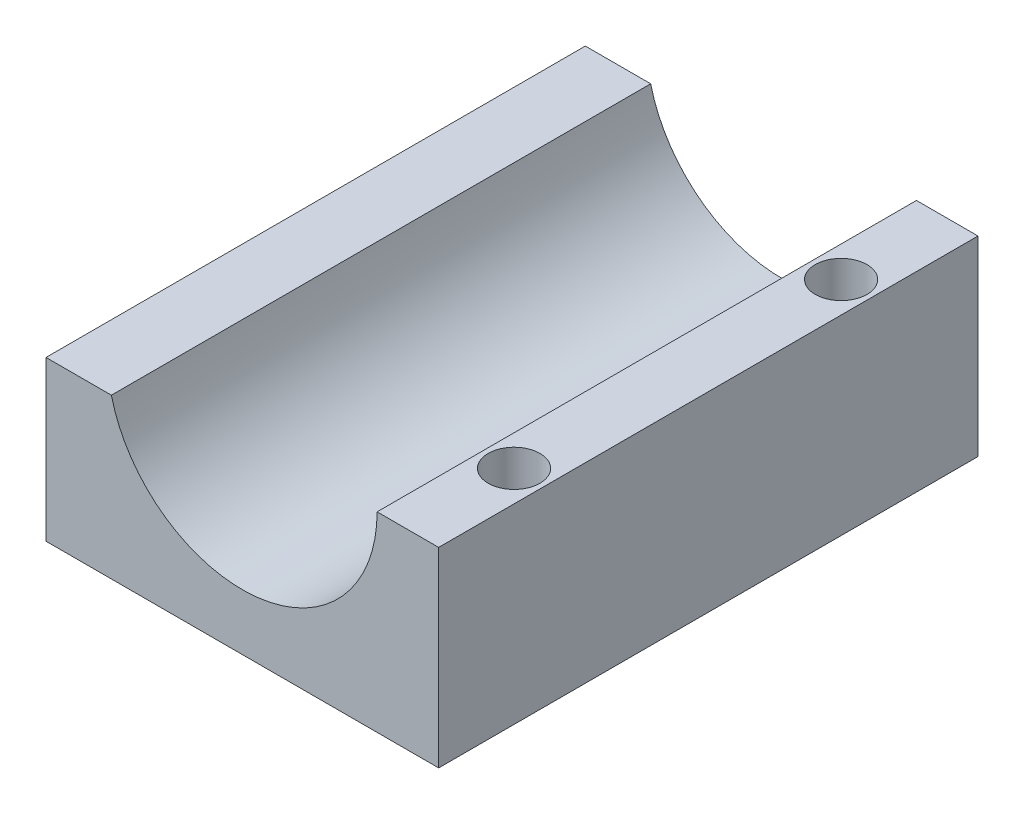
ISO-10303-21;
HEADER;
FILE_DESCRIPTION(('STEP AP214'),'2;1');
FILE_NAME('part.step','',(''),(''),'','','');
FILE_SCHEMA(('AUTOMOTIVE_DESIGN { 1 0 10303 214 1 1 1 1 }'));
ENDSEC;
DATA;
#1=APPLICATION_CONTEXT('core data for automotive mechanical design processes');
#2=APPLICATION_PROTOCOL_DEFINITION('international standard','automotive_design',2000,#1);
#3=PRODUCT_CONTEXT('',#1,'mechanical');
#4=PRODUCT('Part','Part','',(#3));
#5=PRODUCT_RELATED_PRODUCT_CATEGORY('part','',(#4));
#6=PRODUCT_DEFINITION_FORMATION('','',#4);
#7=PRODUCT_DEFINITION_CONTEXT('part definition',#1,'design');
#8=PRODUCT_DEFINITION('design','',#6,#7);
#9=PRODUCT_DEFINITION_SHAPE('','',#8);
#10=(LENGTH_UNIT() NAMED_UNIT(*) SI_UNIT(.MILLI.,.METRE.));
#11=(NAMED_UNIT(*) PLANE_ANGLE_UNIT() SI_UNIT($,.RADIAN.));
#12=(NAMED_UNIT(*) SI_UNIT($,.STERADIAN.) SOLID_ANGLE_UNIT());
#13=UNCERTAINTY_MEASURE_WITH_UNIT(LENGTH_MEASURE(1.E-05),#10,'distance_accuracy_value','');
#14=(GEOMETRIC_REPRESENTATION_CONTEXT(3) GLOBAL_UNCERTAINTY_ASSIGNED_CONTEXT((#13)) GLOBAL_UNIT_ASSIGNED_CONTEXT((#10,
#11,#12)) REPRESENTATION_CONTEXT('',''));
#15=CARTESIAN_POINT('',(0.,0.,0.));
#16=DIRECTION('',(0.,0.,1.));
#17=DIRECTION('',(1.,0.,0.));
#18=AXIS2_PLACEMENT_3D('',#15,#16,#17);
#19=CARTESIAN_POINT('',(0.,9.,0.));
#20=DIRECTION('',(1.,0.,0.));
#21=DIRECTION('',(0.,0.,-1.));
#22=AXIS2_PLACEMENT_3D('',#19,#20,#21);
#23=PLANE('',#22);
#24=DIRECTION('',(0.,0.,1.));
#25=VECTOR('',#24,1.);
#26=CARTESIAN_POINT('',(0.,7.5,-66.2778912014065));
#27=LINE('',#26,#25);
#28=CARTESIAN_POINT('',(0.,7.5,-25.41));
#29=VERTEX_POINT('',#28);
#30=CARTESIAN_POINT('',(0.,7.5,0.));
#31=VERTEX_POINT('',#30);
#32=EDGE_CURVE('E88',#29,#31,#27,.T.);
#33=ORIENTED_EDGE('',*,*,#32,.F.);
#34=DIRECTION('',(0.,-1.,0.));
#35=VECTOR('',#34,1.);
#36=CARTESIAN_POINT('',(0.,9.,-25.41));
#37=LINE('',#36,#35);
#38=CARTESIAN_POINT('',(0.,0.,-25.41));
#39=VERTEX_POINT('',#38);
#40=EDGE_CURVE('E82',#29,#39,#37,.T.);
#41=ORIENTED_EDGE('',*,*,#40,.T.);
#42=DIRECTION('',(0.,0.,1.));
#43=VECTOR('',#42,1.);
#44=CARTESIAN_POINT('',(0.,0.,0.));
#45=LINE('',#44,#43);
#46=CARTESIAN_POINT('',(0.,0.,0.));
#47=VERTEX_POINT('',#46);
#48=EDGE_CURVE('E86',#39,#47,#45,.T.);
#49=ORIENTED_EDGE('',*,*,#48,.T.);
#50=DIRECTION('',(0.,-1.,0.));
#51=VECTOR('',#50,1.);
#52=CARTESIAN_POINT('',(0.,9.,0.));
#53=LINE('',#52,#51);
#54=EDGE_CURVE('E47',#31,#47,#53,.T.);
#55=ORIENTED_EDGE('',*,*,#54,.F.);
#56=EDGE_LOOP('',(#33,#41,#49,#55));
#57=FACE_BOUND('',#56,.T.);
#58=ADVANCED_FACE('F39',(#57),#23,.F.);
#59=CARTESIAN_POINT('',(0.,9.,-25.41));
#60=DIRECTION('',(0.,0.,1.));
#61=DIRECTION('',(1.,0.,0.));
#62=AXIS2_PLACEMENT_3D('',#59,#60,#61);
#63=PLANE('',#62);
#64=DIRECTION('',(-1.,0.,0.));
#65=VECTOR('',#64,1.);
#66=CARTESIAN_POINT('',(0.,7.5,-25.41));
#67=LINE('',#66,#65);
#68=CARTESIAN_POINT('',(3.07970827269893,7.5,-25.41));
#69=VERTEX_POINT('',#68);
#70=EDGE_CURVE('E160',#69,#29,#67,.T.);
#71=ORIENTED_EDGE('',*,*,#70,.F.);
#72=CARTESIAN_POINT('',(9.25,9.,-25.41));
#73=DIRECTION('',(0.,0.,1.));
#74=DIRECTION('',(1.,0.,0.));
#75=AXIS2_PLACEMENT_3D('',#72,#73,#74);
#76=CIRCLE('',#75,6.35);
#77=CARTESIAN_POINT('',(15.6,9.,-25.41));
#78=VERTEX_POINT('',#77);
#79=EDGE_CURVE('E116',#69,#78,#76,.T.);
#80=ORIENTED_EDGE('',*,*,#79,.T.);
#81=DIRECTION('',(-1.,0.,0.));
#82=VECTOR('',#81,1.);
#83=CARTESIAN_POINT('',(0.,9.,-25.41));
#84=LINE('',#83,#82);
#85=CARTESIAN_POINT('',(18.5,9.,-25.41));
#86=VERTEX_POINT('',#85);
#87=EDGE_CURVE('E93',#86,#78,#84,.T.);
#88=ORIENTED_EDGE('',*,*,#87,.F.);
#89=DIRECTION('',(0.,-1.,0.));
#90=VECTOR('',#89,1.);
#91=CARTESIAN_POINT('',(18.5,9.,-25.41));
#92=LINE('',#91,#90);
#93=CARTESIAN_POINT('',(18.5,0.,-25.41));
#94=VERTEX_POINT('',#93);
#95=EDGE_CURVE('E92',#86,#94,#92,.T.);
#96=ORIENTED_EDGE('',*,*,#95,.T.);
#97=DIRECTION('',(-1.,0.,0.));
#98=VECTOR('',#97,1.);
#99=CARTESIAN_POINT('',(0.,0.,-25.41));
#100=LINE('',#99,#98);
#101=EDGE_CURVE('E97',#94,#39,#100,.T.);
#102=ORIENTED_EDGE('',*,*,#101,.T.);
#103=ORIENTED_EDGE('',*,*,#40,.F.);
#104=EDGE_LOOP('',(#71,#80,#88,#96,#102,#103));
#105=FACE_BOUND('',#104,.T.);
#106=ADVANCED_FACE('F98',(#105),#63,.F.);
#107=CARTESIAN_POINT('',(0.,9.,0.));
#108=DIRECTION('',(0.,-1.,0.));
#109=DIRECTION('',(0.,0.,-1.));
#110=AXIS2_PLACEMENT_3D('',#107,#108,#109);
#111=PLANE('',#110);
#112=CARTESIAN_POINT('',(17.05,9.,-20.41));
#113=DIRECTION('',(0.,1.,0.));
#114=DIRECTION('',(0.,0.,1.));
#115=AXIS2_PLACEMENT_3D('',#112,#113,#114);
#116=CIRCLE('',#115,1.22);
#117=CARTESIAN_POINT('',(17.05,9.,-19.19));
#118=VERTEX_POINT('',#117);
#119=EDGE_CURVE('E174',#118,#118,#116,.T.);
#120=ORIENTED_EDGE('',*,*,#119,.F.);
#121=EDGE_LOOP('',(#120));
#122=FACE_BOUND('',#121,.T.);
#123=CARTESIAN_POINT('',(17.05,9.,-5.));
#124=DIRECTION('',(0.,1.,0.));
#125=DIRECTION('',(0.,0.,1.));
#126=AXIS2_PLACEMENT_3D('',#123,#124,#125);
#127=CIRCLE('',#126,1.22);
#128=CARTESIAN_POINT('',(17.05,9.,-3.78));
#129=VERTEX_POINT('',#128);
#130=EDGE_CURVE('E166',#129,#129,#127,.T.);
#131=ORIENTED_EDGE('',*,*,#130,.F.);
#132=EDGE_LOOP('',(#131));
#133=FACE_BOUND('',#132,.T.);
#134=ORIENTED_EDGE('',*,*,#87,.T.);
#135=DIRECTION('',(0.,0.,1.));
#136=VECTOR('',#135,1.);
#137=CARTESIAN_POINT('',(15.6,9.,-25.41));
#138=LINE('',#137,#136);
#139=CARTESIAN_POINT('',(15.6,9.,0.));
#140=VERTEX_POINT('',#139);
#141=EDGE_CURVE('E110',#78,#140,#138,.T.);
#142=ORIENTED_EDGE('',*,*,#141,.T.);
#143=DIRECTION('',(1.,0.,0.));
#144=VECTOR('',#143,1.);
#145=CARTESIAN_POINT('',(0.,9.,0.));
#146=LINE('',#145,#144);
#147=CARTESIAN_POINT('',(18.5,9.,0.));
#148=VERTEX_POINT('',#147);
#149=EDGE_CURVE('E103',#140,#148,#146,.T.);
#150=ORIENTED_EDGE('',*,*,#149,.T.);
#151=DIRECTION('',(0.,0.,-1.));
#152=VECTOR('',#151,1.);
#153=CARTESIAN_POINT('',(18.5,9.,0.));
#154=LINE('',#153,#152);
#155=EDGE_CURVE('E62',#148,#86,#154,.T.);
#156=ORIENTED_EDGE('',*,*,#155,.T.);
#157=EDGE_LOOP('',(#134,#142,#150,#156));
#158=FACE_BOUND('',#157,.T.);
#159=ADVANCED_FACE('F151',(#122,#133,#158),#111,.F.);
#160=CARTESIAN_POINT('',(0.,9.,0.));
#161=DIRECTION('',(0.,0.,-1.));
#162=DIRECTION('',(-1.,0.,0.));
#163=AXIS2_PLACEMENT_3D('',#160,#161,#162);
#164=PLANE('',#163);
#165=CARTESIAN_POINT('',(9.25,9.,0.));
#166=DIRECTION('',(0.,0.,1.));
#167=DIRECTION('',(1.,0.,0.));
#168=AXIS2_PLACEMENT_3D('',#165,#166,#167);
#169=CIRCLE('',#168,6.35);
#170=CARTESIAN_POINT('',(3.07970827269893,7.5,0.));
#171=VERTEX_POINT('',#170);
#172=EDGE_CURVE('E145',#171,#140,#169,.T.);
#173=ORIENTED_EDGE('',*,*,#172,.F.);
#174=DIRECTION('',(-1.,0.,0.));
#175=VECTOR('',#174,1.);
#176=CARTESIAN_POINT('',(0.,7.5,0.));
#177=LINE('',#176,#175);
#178=EDGE_CURVE('E54',#171,#31,#177,.T.);
#179=ORIENTED_EDGE('',*,*,#178,.T.);
#180=ORIENTED_EDGE('',*,*,#54,.T.);
#181=DIRECTION('',(1.,0.,0.));
#182=VECTOR('',#181,1.);
#183=CARTESIAN_POINT('',(0.,0.,0.));
#184=LINE('',#183,#182);
#185=CARTESIAN_POINT('',(18.5,0.,0.));
#186=VERTEX_POINT('',#185);
#187=EDGE_CURVE('E108',#47,#186,#184,.T.);
#188=ORIENTED_EDGE('',*,*,#187,.T.);
#189=DIRECTION('',(0.,-1.,0.));
#190=VECTOR('',#189,1.);
#191=CARTESIAN_POINT('',(18.5,9.,0.));
#192=LINE('',#191,#190);
#193=EDGE_CURVE('E125',#148,#186,#192,.T.);
#194=ORIENTED_EDGE('',*,*,#193,.F.);
#195=ORIENTED_EDGE('',*,*,#149,.F.);
#196=EDGE_LOOP('',(#173,#179,#180,#188,#194,#195));
#197=FACE_BOUND('',#196,.T.);
#198=ADVANCED_FACE('F131',(#197),#164,.F.);
#199=CARTESIAN_POINT('',(18.5,9.,0.));
#200=DIRECTION('',(-1.,0.,0.));
#201=DIRECTION('',(0.,0.,1.));
#202=AXIS2_PLACEMENT_3D('',#199,#200,#201);
#203=PLANE('',#202);
#204=DIRECTION('',(0.,0.,-1.));
#205=VECTOR('',#204,1.);
#206=CARTESIAN_POINT('',(18.5,0.,0.));
#207=LINE('',#206,#205);
#208=EDGE_CURVE('E104',#186,#94,#207,.T.);
#209=ORIENTED_EDGE('',*,*,#208,.T.);
#210=ORIENTED_EDGE('',*,*,#95,.F.);
#211=ORIENTED_EDGE('',*,*,#155,.F.);
#212=ORIENTED_EDGE('',*,*,#193,.T.);
#213=EDGE_LOOP('',(#209,#210,#211,#212));
#214=FACE_BOUND('',#213,.T.);
#215=ADVANCED_FACE('F214',(#214),#203,.F.);
#216=CARTESIAN_POINT('',(0.,0.,0.));
#217=DIRECTION('',(0.,-1.,0.));
#218=DIRECTION('',(0.,0.,-1.));
#219=AXIS2_PLACEMENT_3D('',#216,#217,#218);
#220=PLANE('',#219);
#221=CARTESIAN_POINT('',(17.05,0.,-20.41));
#222=DIRECTION('',(0.,1.,0.));
#223=DIRECTION('',(0.,0.,1.));
#224=AXIS2_PLACEMENT_3D('',#221,#222,#223);
#225=CIRCLE('',#224,1.22);
#226=CARTESIAN_POINT('',(17.05,0.,-19.19));
#227=VERTEX_POINT('',#226);
#228=EDGE_CURVE('E163',#227,#227,#225,.T.);
#229=ORIENTED_EDGE('',*,*,#228,.T.);
#230=EDGE_LOOP('',(#229));
#231=FACE_BOUND('',#230,.T.);
#232=CARTESIAN_POINT('',(17.05,0.,-5.));
#233=DIRECTION('',(0.,1.,0.));
#234=DIRECTION('',(0.,0.,1.));
#235=AXIS2_PLACEMENT_3D('',#232,#233,#234);
#236=CIRCLE('',#235,1.22);
#237=CARTESIAN_POINT('',(17.05,0.,-3.78));
#238=VERTEX_POINT('',#237);
#239=EDGE_CURVE('E170',#238,#238,#236,.T.);
#240=ORIENTED_EDGE('',*,*,#239,.T.);
#241=EDGE_LOOP('',(#240));
#242=FACE_BOUND('',#241,.T.);
#243=ORIENTED_EDGE('',*,*,#48,.F.);
#244=ORIENTED_EDGE('',*,*,#101,.F.);
#245=ORIENTED_EDGE('',*,*,#208,.F.);
#246=ORIENTED_EDGE('',*,*,#187,.F.);
#247=EDGE_LOOP('',(#243,#244,#245,#246));
#248=FACE_BOUND('',#247,.T.);
#249=ADVANCED_FACE('F107',(#231,#242,#248),#220,.T.);
#250=CARTESIAN_POINT('',(9.25,9.,-25.41));
#251=DIRECTION('',(0.,0.,1.));
#252=DIRECTION('',(1.,0.,0.));
#253=AXIS2_PLACEMENT_3D('',#250,#251,#252);
#254=CYLINDRICAL_SURFACE('',#253,6.35);
#255=ORIENTED_EDGE('',*,*,#79,.F.);
#256=DIRECTION('',(0.,0.,1.));
#257=VECTOR('',#256,1.);
#258=CARTESIAN_POINT('',(3.07970827269893,7.5,-25.41));
#259=LINE('',#258,#257);
#260=EDGE_CURVE('E11',#69,#171,#259,.T.);
#261=ORIENTED_EDGE('',*,*,#260,.T.);
#262=ORIENTED_EDGE('',*,*,#172,.T.);
#263=ORIENTED_EDGE('',*,*,#141,.F.);
#264=EDGE_LOOP('',(#255,#261,#262,#263));
#265=FACE_BOUND('',#264,.T.);
#266=ADVANCED_FACE('F147',(#265),#254,.F.);
#267=CARTESIAN_POINT('',(0.,7.5,-66.2778912014065));
#268=DIRECTION('',(0.,-1.,0.));
#269=DIRECTION('',(0.,0.,-1.));
#270=AXIS2_PLACEMENT_3D('',#267,#268,#269);
#271=PLANE('',#270);
#272=ORIENTED_EDGE('',*,*,#260,.F.);
#273=ORIENTED_EDGE('',*,*,#70,.T.);
#274=ORIENTED_EDGE('',*,*,#32,.T.);
#275=ORIENTED_EDGE('',*,*,#178,.F.);
#276=EDGE_LOOP('',(#272,#273,#274,#275));
#277=FACE_BOUND('',#276,.T.);
#278=ADVANCED_FACE('F197',(#277),#271,.F.);
#279=CARTESIAN_POINT('',(17.05,0.,-5.));
#280=DIRECTION('',(0.,1.,0.));
#281=DIRECTION('',(0.,0.,1.));
#282=AXIS2_PLACEMENT_3D('',#279,#280,#281);
#283=CYLINDRICAL_SURFACE('',#282,1.22);
#284=ORIENTED_EDGE('',*,*,#239,.F.);
#285=EDGE_LOOP('',(#284));
#286=FACE_BOUND('',#285,.T.);
#287=ORIENTED_EDGE('',*,*,#130,.T.);
#288=EDGE_LOOP('',(#287));
#289=FACE_BOUND('',#288,.T.);
#290=ADVANCED_FACE('F187',(#286,#289),#283,.F.);
#291=CARTESIAN_POINT('',(17.05,0.,-20.41));
#292=DIRECTION('',(0.,1.,0.));
#293=DIRECTION('',(0.,0.,1.));
#294=AXIS2_PLACEMENT_3D('',#291,#292,#293);
#295=CYLINDRICAL_SURFACE('',#294,1.22);
#296=ORIENTED_EDGE('',*,*,#228,.F.);
#297=EDGE_LOOP('',(#296));
#298=FACE_BOUND('',#297,.T.);
#299=ORIENTED_EDGE('',*,*,#119,.T.);
#300=EDGE_LOOP('',(#299));
#301=FACE_BOUND('',#300,.T.);
#302=ADVANCED_FACE('F184',(#298,#301),#295,.F.);
#303=CLOSED_SHELL('',(#58,#106,#159,#198,#215,#249,#266,#278,#290,#302));
#304=MANIFOLD_SOLID_BREP('B2',#303);
#305=ADVANCED_BREP_SHAPE_REPRESENTATION('',(#18,#304),#14);
#306=SHAPE_DEFINITION_REPRESENTATION(#9,#305);
ENDSEC;
END-ISO-10303-21;
